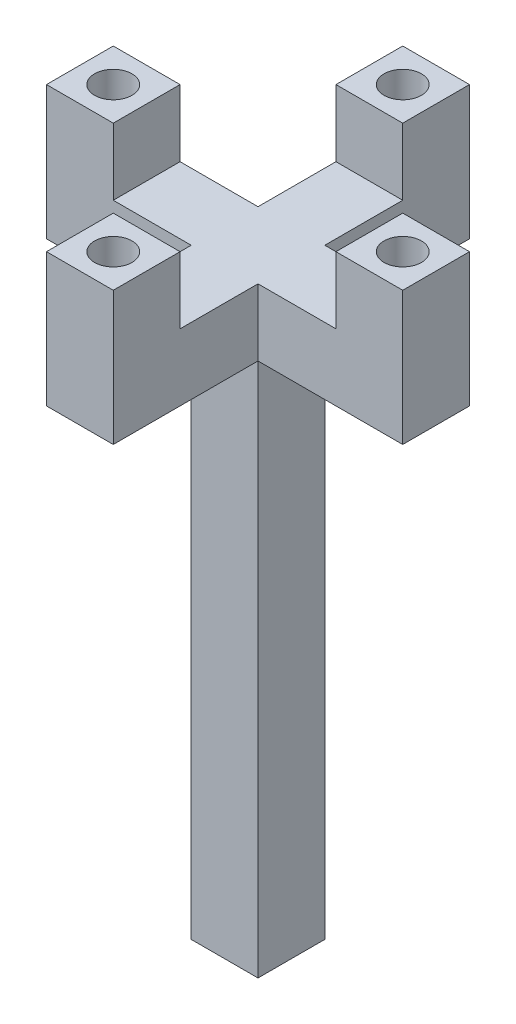
ISO-10303-21;
HEADER;
FILE_DESCRIPTION(('STEP AP214'),'2;1');
FILE_NAME('part.step','',(''),(''),'','','');
FILE_SCHEMA(('AUTOMOTIVE_DESIGN { 1 0 10303 214 1 1 1 1 }'));
ENDSEC;
DATA;
#1=APPLICATION_CONTEXT('core data for automotive mechanical design processes');
#2=APPLICATION_PROTOCOL_DEFINITION('international standard','automotive_design',2000,#1);
#3=PRODUCT_CONTEXT('',#1,'mechanical');
#4=PRODUCT('Part','Part','',(#3));
#5=PRODUCT_RELATED_PRODUCT_CATEGORY('part','',(#4));
#6=PRODUCT_DEFINITION_FORMATION('','',#4);
#7=PRODUCT_DEFINITION_CONTEXT('part definition',#1,'design');
#8=PRODUCT_DEFINITION('design','',#6,#7);
#9=PRODUCT_DEFINITION_SHAPE('','',#8);
#10=(LENGTH_UNIT() NAMED_UNIT(*) SI_UNIT(.MILLI.,.METRE.));
#11=(NAMED_UNIT(*) PLANE_ANGLE_UNIT() SI_UNIT($,.RADIAN.));
#12=(NAMED_UNIT(*) SI_UNIT($,.STERADIAN.) SOLID_ANGLE_UNIT());
#13=UNCERTAINTY_MEASURE_WITH_UNIT(LENGTH_MEASURE(1.E-05),#10,'distance_accuracy_value','');
#14=(GEOMETRIC_REPRESENTATION_CONTEXT(3) GLOBAL_UNCERTAINTY_ASSIGNED_CONTEXT((#13)) GLOBAL_UNIT_ASSIGNED_CONTEXT((#10,
#11,#12)) REPRESENTATION_CONTEXT('',''));
#15=CARTESIAN_POINT('',(0.,0.,0.));
#16=DIRECTION('',(0.,0.,1.));
#17=DIRECTION('',(1.,0.,0.));
#18=AXIS2_PLACEMENT_3D('',#15,#16,#17);
#19=CARTESIAN_POINT('',(0.,0.,7.5));
#20=DIRECTION('',(0.,0.,-1.));
#21=DIRECTION('',(-1.,0.,0.));
#22=AXIS2_PLACEMENT_3D('',#19,#20,#21);
#23=PLANE('',#22);
#24=DIRECTION('',(0.,-1.,0.));
#25=VECTOR('',#24,1.);
#26=CARTESIAN_POINT('',(-3.75000000000001,0.,7.5));
#27=LINE('',#26,#25);
#28=CARTESIAN_POINT('',(-3.75000000000001,67.5,7.5));
#29=VERTEX_POINT('',#28);
#30=CARTESIAN_POINT('',(-3.75000000000001,60.,7.49999999999999));
#31=VERTEX_POINT('',#30);
#32=EDGE_CURVE('E214',#29,#31,#27,.T.);
#33=ORIENTED_EDGE('',*,*,#32,.F.);
#34=DIRECTION('',(-1.,0.,0.));
#35=VECTOR('',#34,1.);
#36=CARTESIAN_POINT('',(12.5,67.5,7.5));
#37=LINE('',#36,#35);
#38=CARTESIAN_POINT('',(-12.5,67.5,7.5));
#39=VERTEX_POINT('',#38);
#40=EDGE_CURVE('E191',#29,#39,#37,.T.);
#41=ORIENTED_EDGE('',*,*,#40,.T.);
#42=DIRECTION('',(0.,1.,0.));
#43=VECTOR('',#42,1.);
#44=CARTESIAN_POINT('',(-12.5,67.5,7.5));
#45=LINE('',#44,#43);
#46=CARTESIAN_POINT('',(-12.5,75.,7.5));
#47=VERTEX_POINT('',#46);
#48=EDGE_CURVE('E242',#39,#47,#45,.T.);
#49=ORIENTED_EDGE('',*,*,#48,.T.);
#50=DIRECTION('',(-1.,0.,0.));
#51=VECTOR('',#50,1.);
#52=CARTESIAN_POINT('',(-12.5,75.,7.5));
#53=LINE('',#52,#51);
#54=CARTESIAN_POINT('',(-20.,75.,7.5));
#55=VERTEX_POINT('',#54);
#56=EDGE_CURVE('E244',#47,#55,#53,.T.);
#57=ORIENTED_EDGE('',*,*,#56,.T.);
#58=DIRECTION('',(0.,-1.,0.));
#59=VECTOR('',#58,1.);
#60=CARTESIAN_POINT('',(-20.,75.,7.5));
#61=LINE('',#60,#59);
#62=CARTESIAN_POINT('',(-20.,60.,7.5));
#63=VERTEX_POINT('',#62);
#64=EDGE_CURVE('E246',#55,#63,#61,.T.);
#65=ORIENTED_EDGE('',*,*,#64,.T.);
#66=DIRECTION('',(1.,0.,0.));
#67=VECTOR('',#66,1.);
#68=CARTESIAN_POINT('',(-20.,60.,7.5));
#69=LINE('',#68,#67);
#70=EDGE_CURVE('E248',#63,#31,#69,.T.);
#71=ORIENTED_EDGE('',*,*,#70,.T.);
#72=EDGE_LOOP('',(#33,#41,#49,#57,#65,#71));
#73=FACE_BOUND('',#72,.T.);
#74=ADVANCED_FACE('F36',(#73),#23,.F.);
#75=DIRECTION('',(1.,0.,0.));
#76=VECTOR('',#75,1.);
#77=CARTESIAN_POINT('',(-3.75000000000001,60.,7.49999999999999));
#78=LINE('',#77,#76);
#79=CARTESIAN_POINT('',(3.75,60.,7.5));
#80=VERTEX_POINT('',#79);
#81=EDGE_CURVE('E361',#31,#80,#78,.T.);
#82=ORIENTED_EDGE('',*,*,#81,.F.);
#83=DIRECTION('',(0.,-1.,0.));
#84=VECTOR('',#83,1.);
#85=CARTESIAN_POINT('',(-3.75,60.,7.5));
#86=LINE('',#85,#84);
#87=CARTESIAN_POINT('',(-3.75,0.,7.5));
#88=VERTEX_POINT('',#87);
#89=EDGE_CURVE('E251',#31,#88,#86,.T.);
#90=ORIENTED_EDGE('',*,*,#89,.T.);
#91=DIRECTION('',(1.,0.,0.));
#92=VECTOR('',#91,1.);
#93=CARTESIAN_POINT('',(3.75,0.,7.5));
#94=LINE('',#93,#92);
#95=CARTESIAN_POINT('',(3.75,0.,7.5));
#96=VERTEX_POINT('',#95);
#97=EDGE_CURVE('E253',#88,#96,#94,.T.);
#98=ORIENTED_EDGE('',*,*,#97,.T.);
#99=DIRECTION('',(0.,1.,0.));
#100=VECTOR('',#99,1.);
#101=CARTESIAN_POINT('',(3.75,60.,7.5));
#102=LINE('',#101,#100);
#103=EDGE_CURVE('E255',#96,#80,#102,.T.);
#104=ORIENTED_EDGE('',*,*,#103,.T.);
#105=EDGE_LOOP('',(#82,#90,#98,#104));
#106=FACE_BOUND('',#105,.T.);
#107=ADVANCED_FACE('F430',(#106),#23,.F.);
#108=CARTESIAN_POINT('',(0.,0.,0.));
#109=DIRECTION('',(0.,0.,-1.));
#110=DIRECTION('',(-1.,0.,0.));
#111=AXIS2_PLACEMENT_3D('',#108,#109,#110);
#112=PLANE('',#111);
#113=DIRECTION('',(-1.,0.,0.));
#114=VECTOR('',#113,1.);
#115=CARTESIAN_POINT('',(0.,67.5,0.));
#116=LINE('',#115,#114);
#117=CARTESIAN_POINT('',(-3.74999999999999,67.5,0.));
#118=VERTEX_POINT('',#117);
#119=CARTESIAN_POINT('',(-12.5,67.5,0.));
#120=VERTEX_POINT('',#119);
#121=EDGE_CURVE('E50',#118,#120,#116,.T.);
#122=ORIENTED_EDGE('',*,*,#121,.F.);
#123=DIRECTION('',(0.,-1.,0.));
#124=VECTOR('',#123,1.);
#125=CARTESIAN_POINT('',(-3.74999999999999,0.,0.));
#126=LINE('',#125,#124);
#127=CARTESIAN_POINT('',(-3.75,60.,0.));
#128=VERTEX_POINT('',#127);
#129=EDGE_CURVE('E11',#118,#128,#126,.T.);
#130=ORIENTED_EDGE('',*,*,#129,.T.);
#131=DIRECTION('',(1.,0.,0.));
#132=VECTOR('',#131,1.);
#133=CARTESIAN_POINT('',(-20.,60.,0.));
#134=LINE('',#133,#132);
#135=CARTESIAN_POINT('',(-20.,60.,0.));
#136=VERTEX_POINT('',#135);
#137=EDGE_CURVE('E275',#136,#128,#134,.T.);
#138=ORIENTED_EDGE('',*,*,#137,.F.);
#139=DIRECTION('',(0.,-1.,0.));
#140=VECTOR('',#139,1.);
#141=CARTESIAN_POINT('',(-20.,75.,0.));
#142=LINE('',#141,#140);
#143=CARTESIAN_POINT('',(-20.,75.,0.));
#144=VERTEX_POINT('',#143);
#145=EDGE_CURVE('E273',#144,#136,#142,.T.);
#146=ORIENTED_EDGE('',*,*,#145,.F.);
#147=DIRECTION('',(-1.,0.,0.));
#148=VECTOR('',#147,1.);
#149=CARTESIAN_POINT('',(-12.5,75.,0.));
#150=LINE('',#149,#148);
#151=CARTESIAN_POINT('',(-12.5,75.,0.));
#152=VERTEX_POINT('',#151);
#153=EDGE_CURVE('E271',#152,#144,#150,.T.);
#154=ORIENTED_EDGE('',*,*,#153,.F.);
#155=DIRECTION('',(0.,1.,0.));
#156=VECTOR('',#155,1.);
#157=CARTESIAN_POINT('',(-12.5,67.5,0.));
#158=LINE('',#157,#156);
#159=EDGE_CURVE('E269',#120,#152,#158,.T.);
#160=ORIENTED_EDGE('',*,*,#159,.F.);
#161=EDGE_LOOP('',(#122,#130,#138,#146,#154,#160));
#162=FACE_BOUND('',#161,.T.);
#163=ADVANCED_FACE('F437',(#162),#112,.T.);
#164=DIRECTION('',(0.,-1.,0.));
#165=VECTOR('',#164,1.);
#166=CARTESIAN_POINT('',(-3.75,60.,0.));
#167=LINE('',#166,#165);
#168=CARTESIAN_POINT('',(-3.75,0.,0.));
#169=VERTEX_POINT('',#168);
#170=EDGE_CURVE('E278',#128,#169,#167,.T.);
#171=ORIENTED_EDGE('',*,*,#170,.F.);
#172=DIRECTION('',(1.,0.,0.));
#173=VECTOR('',#172,1.);
#174=CARTESIAN_POINT('',(-3.74999999999999,60.,0.));
#175=LINE('',#174,#173);
#176=CARTESIAN_POINT('',(3.75000000000001,60.,0.));
#177=VERTEX_POINT('',#176);
#178=EDGE_CURVE('E339',#128,#177,#175,.T.);
#179=ORIENTED_EDGE('',*,*,#178,.T.);
#180=DIRECTION('',(0.,1.,0.));
#181=VECTOR('',#180,1.);
#182=CARTESIAN_POINT('',(3.75,60.,0.));
#183=LINE('',#182,#181);
#184=CARTESIAN_POINT('',(3.75,0.,0.));
#185=VERTEX_POINT('',#184);
#186=EDGE_CURVE('E282',#185,#177,#183,.T.);
#187=ORIENTED_EDGE('',*,*,#186,.F.);
#188=DIRECTION('',(1.,0.,0.));
#189=VECTOR('',#188,1.);
#190=CARTESIAN_POINT('',(3.75,0.,0.));
#191=LINE('',#190,#189);
#192=EDGE_CURVE('E280',#169,#185,#191,.T.);
#193=ORIENTED_EDGE('',*,*,#192,.F.);
#194=EDGE_LOOP('',(#171,#179,#187,#193));
#195=FACE_BOUND('',#194,.T.);
#196=ADVANCED_FACE('F450',(#195),#112,.T.);
#197=CARTESIAN_POINT('',(12.5,75.,7.5));
#198=DIRECTION('',(1.,0.,0.));
#199=DIRECTION('',(0.,0.,-1.));
#200=AXIS2_PLACEMENT_3D('',#197,#198,#199);
#201=PLANE('',#200);
#202=DIRECTION('',(0.,-1.,0.));
#203=VECTOR('',#202,1.);
#204=CARTESIAN_POINT('',(12.5,75.,0.));
#205=LINE('',#204,#203);
#206=CARTESIAN_POINT('',(12.5,75.,0.));
#207=VERTEX_POINT('',#206);
#208=CARTESIAN_POINT('',(12.5,67.5,0.));
#209=VERTEX_POINT('',#208);
#210=EDGE_CURVE('E226',#207,#209,#205,.T.);
#211=ORIENTED_EDGE('',*,*,#210,.T.);
#212=DIRECTION('',(0.,0.,-1.));
#213=VECTOR('',#212,1.);
#214=CARTESIAN_POINT('',(12.5,67.5,7.5));
#215=LINE('',#214,#213);
#216=CARTESIAN_POINT('',(12.5,67.5,7.5));
#217=VERTEX_POINT('',#216);
#218=EDGE_CURVE('E322',#217,#209,#215,.T.);
#219=ORIENTED_EDGE('',*,*,#218,.F.);
#220=DIRECTION('',(0.,-1.,0.));
#221=VECTOR('',#220,1.);
#222=CARTESIAN_POINT('',(12.5,75.,7.5));
#223=LINE('',#222,#221);
#224=CARTESIAN_POINT('',(12.5,75.,7.5));
#225=VERTEX_POINT('',#224);
#226=EDGE_CURVE('E235',#225,#217,#223,.T.);
#227=ORIENTED_EDGE('',*,*,#226,.F.);
#228=DIRECTION('',(0.,0.,-1.));
#229=VECTOR('',#228,1.);
#230=CARTESIAN_POINT('',(12.5,75.,7.5));
#231=LINE('',#230,#229);
#232=EDGE_CURVE('E264',#225,#207,#231,.T.);
#233=ORIENTED_EDGE('',*,*,#232,.T.);
#234=EDGE_LOOP('',(#211,#219,#227,#233));
#235=FACE_BOUND('',#234,.T.);
#236=ADVANCED_FACE('F38',(#235),#201,.F.);
#237=CARTESIAN_POINT('',(0.,67.5,7.5));
#238=DIRECTION('',(0.,-1.,0.));
#239=DIRECTION('',(0.,0.,-1.));
#240=AXIS2_PLACEMENT_3D('',#237,#238,#239);
#241=PLANE('',#240);
#242=ORIENTED_EDGE('',*,*,#40,.F.);
#243=DIRECTION('',(0.,0.,-1.));
#244=VECTOR('',#243,1.);
#245=CARTESIAN_POINT('',(-3.75000000000004,67.5,16.25));
#246=LINE('',#245,#244);
#247=CARTESIAN_POINT('',(-3.75000000000004,67.5,16.25));
#248=VERTEX_POINT('',#247);
#249=EDGE_CURVE('E183',#248,#29,#246,.T.);
#250=ORIENTED_EDGE('',*,*,#249,.F.);
#251=DIRECTION('',(1.,0.,0.));
#252=VECTOR('',#251,1.);
#253=CARTESIAN_POINT('',(-3.75000000000004,67.5,16.25));
#254=LINE('',#253,#252);
#255=CARTESIAN_POINT('',(3.74999999999996,67.5,16.25));
#256=VERTEX_POINT('',#255);
#257=EDGE_CURVE('E188',#248,#256,#254,.T.);
#258=ORIENTED_EDGE('',*,*,#257,.T.);
#259=DIRECTION('',(0.,0.,-1.));
#260=VECTOR('',#259,1.);
#261=CARTESIAN_POINT('',(3.75,67.5,3.75000000000001));
#262=LINE('',#261,#260);
#263=CARTESIAN_POINT('',(3.74999999999999,67.5,7.5));
#264=VERTEX_POINT('',#263);
#265=EDGE_CURVE('E379',#256,#264,#262,.T.);
#266=ORIENTED_EDGE('',*,*,#265,.T.);
#267=EDGE_CURVE('E239',#217,#264,#37,.T.);
#268=ORIENTED_EDGE('',*,*,#267,.F.);
#269=ORIENTED_EDGE('',*,*,#218,.T.);
#270=CARTESIAN_POINT('',(3.75000000000001,67.5,0.));
#271=VERTEX_POINT('',#270);
#272=EDGE_CURVE('E267',#209,#271,#116,.T.);
#273=ORIENTED_EDGE('',*,*,#272,.T.);
#274=CARTESIAN_POINT('',(3.75000000000004,67.5,-8.74999999999999));
#275=VERTEX_POINT('',#274);
#276=EDGE_CURVE('E332',#271,#275,#262,.T.);
#277=ORIENTED_EDGE('',*,*,#276,.T.);
#278=DIRECTION('',(1.,0.,0.));
#279=VECTOR('',#278,1.);
#280=CARTESIAN_POINT('',(-3.74999999999996,67.5,-8.75000000000001));
#281=LINE('',#280,#279);
#282=CARTESIAN_POINT('',(-3.74999999999996,67.5,-8.75000000000001));
#283=VERTEX_POINT('',#282);
#284=EDGE_CURVE('E211',#283,#275,#281,.T.);
#285=ORIENTED_EDGE('',*,*,#284,.F.);
#286=EDGE_CURVE('E195',#118,#283,#246,.T.);
#287=ORIENTED_EDGE('',*,*,#286,.F.);
#288=ORIENTED_EDGE('',*,*,#121,.T.);
#289=DIRECTION('',(0.,0.,-1.));
#290=VECTOR('',#289,1.);
#291=CARTESIAN_POINT('',(-12.5,67.5,7.5));
#292=LINE('',#291,#290);
#293=EDGE_CURVE('E319',#39,#120,#292,.T.);
#294=ORIENTED_EDGE('',*,*,#293,.F.);
#295=EDGE_LOOP('',(#242,#250,#258,#266,#268,#269,#273,#277,#285,#287,#288,#294));
#296=FACE_BOUND('',#295,.T.);
#297=ADVANCED_FACE('F185',(#296),#241,.F.);
#298=CARTESIAN_POINT('',(-12.5,67.5,7.5));
#299=DIRECTION('',(-1.,0.,0.));
#300=DIRECTION('',(0.,0.,1.));
#301=AXIS2_PLACEMENT_3D('',#298,#299,#300);
#302=PLANE('',#301);
#303=ORIENTED_EDGE('',*,*,#159,.T.);
#304=DIRECTION('',(0.,0.,-1.));
#305=VECTOR('',#304,1.);
#306=CARTESIAN_POINT('',(-12.5,75.,7.5));
#307=LINE('',#306,#305);
#308=EDGE_CURVE('E316',#47,#152,#307,.T.);
#309=ORIENTED_EDGE('',*,*,#308,.F.);
#310=ORIENTED_EDGE('',*,*,#48,.F.);
#311=ORIENTED_EDGE('',*,*,#293,.T.);
#312=EDGE_LOOP('',(#303,#309,#310,#311));
#313=FACE_BOUND('',#312,.T.);
#314=ADVANCED_FACE('F506',(#313),#302,.F.);
#315=CARTESIAN_POINT('',(-12.5,75.,7.5));
#316=DIRECTION('',(0.,-1.,0.));
#317=DIRECTION('',(0.,0.,-1.));
#318=AXIS2_PLACEMENT_3D('',#315,#316,#317);
#319=PLANE('',#318);
#320=CARTESIAN_POINT('',(-16.25,75.,3.75));
#321=DIRECTION('',(0.,1.,0.));
#322=DIRECTION('',(0.,0.,1.));
#323=AXIS2_PLACEMENT_3D('',#320,#321,#322);
#324=CIRCLE('',#323,2.1);
#325=CARTESIAN_POINT('',(-16.25,75.,5.85));
#326=VERTEX_POINT('',#325);
#327=EDGE_CURVE('E227',#326,#326,#324,.T.);
#328=ORIENTED_EDGE('',*,*,#327,.F.);
#329=EDGE_LOOP('',(#328));
#330=FACE_BOUND('',#329,.T.);
#331=ORIENTED_EDGE('',*,*,#153,.T.);
#332=DIRECTION('',(0.,0.,-1.));
#333=VECTOR('',#332,1.);
#334=CARTESIAN_POINT('',(-20.,75.,7.5));
#335=LINE('',#334,#333);
#336=EDGE_CURVE('E313',#55,#144,#335,.T.);
#337=ORIENTED_EDGE('',*,*,#336,.F.);
#338=ORIENTED_EDGE('',*,*,#56,.F.);
#339=ORIENTED_EDGE('',*,*,#308,.T.);
#340=EDGE_LOOP('',(#331,#337,#338,#339));
#341=FACE_BOUND('',#340,.T.);
#342=ADVANCED_FACE('F512',(#330,#341),#319,.F.);
#343=CARTESIAN_POINT('',(-20.,75.,7.5));
#344=DIRECTION('',(1.,0.,0.));
#345=DIRECTION('',(0.,0.,-1.));
#346=AXIS2_PLACEMENT_3D('',#343,#344,#345);
#347=PLANE('',#346);
#348=ORIENTED_EDGE('',*,*,#145,.T.);
#349=DIRECTION('',(0.,0.,-1.));
#350=VECTOR('',#349,1.);
#351=CARTESIAN_POINT('',(-20.,60.,7.5));
#352=LINE('',#351,#350);
#353=EDGE_CURVE('E310',#63,#136,#352,.T.);
#354=ORIENTED_EDGE('',*,*,#353,.F.);
#355=ORIENTED_EDGE('',*,*,#64,.F.);
#356=ORIENTED_EDGE('',*,*,#336,.T.);
#357=EDGE_LOOP('',(#348,#354,#355,#356));
#358=FACE_BOUND('',#357,.T.);
#359=ADVANCED_FACE('F515',(#358),#347,.F.);
#360=CARTESIAN_POINT('',(-20.,60.,7.5));
#361=DIRECTION('',(0.,1.,0.));
#362=DIRECTION('',(-1.,0.,0.));
#363=AXIS2_PLACEMENT_3D('',#360,#361,#362);
#364=PLANE('',#363);
#365=ORIENTED_EDGE('',*,*,#137,.T.);
#366=DIRECTION('',(0.,0.,-1.));
#367=VECTOR('',#366,1.);
#368=CARTESIAN_POINT('',(-3.75,60.,7.5));
#369=LINE('',#368,#367);
#370=EDGE_CURVE('E307',#31,#128,#369,.T.);
#371=ORIENTED_EDGE('',*,*,#370,.F.);
#372=ORIENTED_EDGE('',*,*,#70,.F.);
#373=ORIENTED_EDGE('',*,*,#353,.T.);
#374=EDGE_LOOP('',(#365,#371,#372,#373));
#375=FACE_BOUND('',#374,.T.);
#376=ADVANCED_FACE('F474',(#375),#364,.F.);
#377=CARTESIAN_POINT('',(-3.75,60.,7.5));
#378=DIRECTION('',(1.,0.,0.));
#379=DIRECTION('',(0.,0.,-1.));
#380=AXIS2_PLACEMENT_3D('',#377,#378,#379);
#381=PLANE('',#380);
#382=ORIENTED_EDGE('',*,*,#170,.T.);
#383=DIRECTION('',(0.,0.,-1.));
#384=VECTOR('',#383,1.);
#385=CARTESIAN_POINT('',(-3.75,0.,7.5));
#386=LINE('',#385,#384);
#387=EDGE_CURVE('E304',#88,#169,#386,.T.);
#388=ORIENTED_EDGE('',*,*,#387,.F.);
#389=ORIENTED_EDGE('',*,*,#89,.F.);
#390=ORIENTED_EDGE('',*,*,#370,.T.);
#391=EDGE_LOOP('',(#382,#388,#389,#390));
#392=FACE_BOUND('',#391,.T.);
#393=ADVANCED_FACE('F478',(#392),#381,.F.);
#394=CARTESIAN_POINT('',(3.75,0.,7.5));
#395=DIRECTION('',(0.,1.,0.));
#396=DIRECTION('',(0.,0.,1.));
#397=AXIS2_PLACEMENT_3D('',#394,#395,#396);
#398=PLANE('',#397);
#399=ORIENTED_EDGE('',*,*,#192,.T.);
#400=DIRECTION('',(0.,0.,-1.));
#401=VECTOR('',#400,1.);
#402=CARTESIAN_POINT('',(3.75,0.,7.5));
#403=LINE('',#402,#401);
#404=EDGE_CURVE('E301',#96,#185,#403,.T.);
#405=ORIENTED_EDGE('',*,*,#404,.F.);
#406=ORIENTED_EDGE('',*,*,#97,.F.);
#407=ORIENTED_EDGE('',*,*,#387,.T.);
#408=EDGE_LOOP('',(#399,#405,#406,#407));
#409=FACE_BOUND('',#408,.T.);
#410=ADVANCED_FACE('F483',(#409),#398,.F.);
#411=CARTESIAN_POINT('',(3.75,60.,7.5));
#412=DIRECTION('',(-1.,0.,0.));
#413=DIRECTION('',(0.,0.,1.));
#414=AXIS2_PLACEMENT_3D('',#411,#412,#413);
#415=PLANE('',#414);
#416=ORIENTED_EDGE('',*,*,#186,.T.);
#417=DIRECTION('',(0.,0.,-1.));
#418=VECTOR('',#417,1.);
#419=CARTESIAN_POINT('',(3.75,60.,7.5));
#420=LINE('',#419,#418);
#421=EDGE_CURVE('E298',#80,#177,#420,.T.);
#422=ORIENTED_EDGE('',*,*,#421,.F.);
#423=ORIENTED_EDGE('',*,*,#103,.F.);
#424=ORIENTED_EDGE('',*,*,#404,.T.);
#425=EDGE_LOOP('',(#416,#422,#423,#424));
#426=FACE_BOUND('',#425,.T.);
#427=ADVANCED_FACE('F486',(#426),#415,.F.);
#428=CARTESIAN_POINT('',(20.,60.,7.5));
#429=DIRECTION('',(0.,1.,0.));
#430=DIRECTION('',(-1.,0.,0.));
#431=AXIS2_PLACEMENT_3D('',#428,#429,#430);
#432=PLANE('',#431);
#433=DIRECTION('',(1.,0.,0.));
#434=VECTOR('',#433,1.);
#435=CARTESIAN_POINT('',(20.,60.,0.));
#436=LINE('',#435,#434);
#437=CARTESIAN_POINT('',(20.,60.,0.));
#438=VERTEX_POINT('',#437);
#439=EDGE_CURVE('E285',#177,#438,#436,.T.);
#440=ORIENTED_EDGE('',*,*,#439,.T.);
#441=DIRECTION('',(0.,0.,-1.));
#442=VECTOR('',#441,1.);
#443=CARTESIAN_POINT('',(20.,60.,7.5));
#444=LINE('',#443,#442);
#445=CARTESIAN_POINT('',(20.,60.,7.5));
#446=VERTEX_POINT('',#445);
#447=EDGE_CURVE('E295',#446,#438,#444,.T.);
#448=ORIENTED_EDGE('',*,*,#447,.F.);
#449=DIRECTION('',(1.,0.,0.));
#450=VECTOR('',#449,1.);
#451=CARTESIAN_POINT('',(20.,60.,7.5));
#452=LINE('',#451,#450);
#453=EDGE_CURVE('E258',#80,#446,#452,.T.);
#454=ORIENTED_EDGE('',*,*,#453,.F.);
#455=ORIENTED_EDGE('',*,*,#421,.T.);
#456=EDGE_LOOP('',(#440,#448,#454,#455));
#457=FACE_BOUND('',#456,.T.);
#458=ADVANCED_FACE('F490',(#457),#432,.F.);
#459=CARTESIAN_POINT('',(20.,75.,7.5));
#460=DIRECTION('',(-1.,0.,0.));
#461=DIRECTION('',(0.,-1.,0.));
#462=AXIS2_PLACEMENT_3D('',#459,#460,#461);
#463=PLANE('',#462);
#464=DIRECTION('',(0.,1.,0.));
#465=VECTOR('',#464,1.);
#466=CARTESIAN_POINT('',(20.,75.,0.));
#467=LINE('',#466,#465);
#468=CARTESIAN_POINT('',(20.,75.,0.));
#469=VERTEX_POINT('',#468);
#470=EDGE_CURVE('E287',#438,#469,#467,.T.);
#471=ORIENTED_EDGE('',*,*,#470,.T.);
#472=DIRECTION('',(0.,0.,-1.));
#473=VECTOR('',#472,1.);
#474=CARTESIAN_POINT('',(20.,75.,7.5));
#475=LINE('',#474,#473);
#476=CARTESIAN_POINT('',(20.,75.,7.5));
#477=VERTEX_POINT('',#476);
#478=EDGE_CURVE('E292',#477,#469,#475,.T.);
#479=ORIENTED_EDGE('',*,*,#478,.F.);
#480=DIRECTION('',(0.,1.,0.));
#481=VECTOR('',#480,1.);
#482=CARTESIAN_POINT('',(20.,75.,7.5));
#483=LINE('',#482,#481);
#484=EDGE_CURVE('E260',#446,#477,#483,.T.);
#485=ORIENTED_EDGE('',*,*,#484,.F.);
#486=ORIENTED_EDGE('',*,*,#447,.T.);
#487=EDGE_LOOP('',(#471,#479,#485,#486));
#488=FACE_BOUND('',#487,.T.);
#489=ADVANCED_FACE('F451',(#488),#463,.F.);
#490=CARTESIAN_POINT('',(12.5,75.,7.5));
#491=DIRECTION('',(0.,-1.,0.));
#492=DIRECTION('',(0.,0.,-1.));
#493=AXIS2_PLACEMENT_3D('',#490,#491,#492);
#494=PLANE('',#493);
#495=CARTESIAN_POINT('',(16.25,75.,3.75));
#496=DIRECTION('',(0.,1.,0.));
#497=DIRECTION('',(0.,0.,1.));
#498=AXIS2_PLACEMENT_3D('',#495,#496,#497);
#499=CIRCLE('',#498,2.1);
#500=CARTESIAN_POINT('',(16.25,75.,5.85));
#501=VERTEX_POINT('',#500);
#502=EDGE_CURVE('E222',#501,#501,#499,.T.);
#503=ORIENTED_EDGE('',*,*,#502,.F.);
#504=EDGE_LOOP('',(#503));
#505=FACE_BOUND('',#504,.T.);
#506=DIRECTION('',(-1.,0.,0.));
#507=VECTOR('',#506,1.);
#508=CARTESIAN_POINT('',(12.5,75.,0.));
#509=LINE('',#508,#507);
#510=EDGE_CURVE('E238',#469,#207,#509,.T.);
#511=ORIENTED_EDGE('',*,*,#510,.T.);
#512=ORIENTED_EDGE('',*,*,#232,.F.);
#513=DIRECTION('',(-1.,0.,0.));
#514=VECTOR('',#513,1.);
#515=CARTESIAN_POINT('',(12.5,75.,7.5));
#516=LINE('',#515,#514);
#517=EDGE_CURVE('E262',#477,#225,#516,.T.);
#518=ORIENTED_EDGE('',*,*,#517,.F.);
#519=ORIENTED_EDGE('',*,*,#478,.T.);
#520=EDGE_LOOP('',(#511,#512,#518,#519));
#521=FACE_BOUND('',#520,.T.);
#522=ADVANCED_FACE('F443',(#505,#521),#494,.F.);
#523=ORIENTED_EDGE('',*,*,#267,.T.);
#524=DIRECTION('',(0.,-1.,0.));
#525=VECTOR('',#524,1.);
#526=CARTESIAN_POINT('',(3.74999999999999,0.,7.5));
#527=LINE('',#526,#525);
#528=EDGE_CURVE('E210',#264,#80,#527,.T.);
#529=ORIENTED_EDGE('',*,*,#528,.T.);
#530=ORIENTED_EDGE('',*,*,#453,.T.);
#531=ORIENTED_EDGE('',*,*,#484,.T.);
#532=ORIENTED_EDGE('',*,*,#517,.T.);
#533=ORIENTED_EDGE('',*,*,#226,.T.);
#534=EDGE_LOOP('',(#523,#529,#530,#531,#532,#533));
#535=FACE_BOUND('',#534,.T.);
#536=ADVANCED_FACE('F433',(#535),#23,.F.);
#537=DIRECTION('',(0.,-1.,0.));
#538=VECTOR('',#537,1.);
#539=CARTESIAN_POINT('',(3.75000000000001,0.,0.));
#540=LINE('',#539,#538);
#541=EDGE_CURVE('E44',#271,#177,#540,.T.);
#542=ORIENTED_EDGE('',*,*,#541,.F.);
#543=ORIENTED_EDGE('',*,*,#272,.F.);
#544=ORIENTED_EDGE('',*,*,#210,.F.);
#545=ORIENTED_EDGE('',*,*,#510,.F.);
#546=ORIENTED_EDGE('',*,*,#470,.F.);
#547=ORIENTED_EDGE('',*,*,#439,.F.);
#548=EDGE_LOOP('',(#542,#543,#544,#545,#546,#547));
#549=FACE_BOUND('',#548,.T.);
#550=ADVANCED_FACE('F442',(#549),#112,.T.);
#551=CARTESIAN_POINT('',(16.25,70.,3.75));
#552=DIRECTION('',(0.,1.,0.));
#553=DIRECTION('',(0.,0.,1.));
#554=AXIS2_PLACEMENT_3D('',#551,#552,#553);
#555=CYLINDRICAL_SURFACE('',#554,2.1);
#556=CARTESIAN_POINT('',(16.25,70.,3.75));
#557=DIRECTION('',(0.,1.,0.));
#558=DIRECTION('',(0.,0.,1.));
#559=AXIS2_PLACEMENT_3D('',#556,#557,#558);
#560=CIRCLE('',#559,2.1);
#561=CARTESIAN_POINT('',(16.25,70.,5.85));
#562=VERTEX_POINT('',#561);
#563=EDGE_CURVE('E230',#562,#562,#560,.T.);
#564=ORIENTED_EDGE('',*,*,#563,.F.);
#565=EDGE_LOOP('',(#564));
#566=FACE_BOUND('',#565,.T.);
#567=ORIENTED_EDGE('',*,*,#502,.T.);
#568=EDGE_LOOP('',(#567));
#569=FACE_BOUND('',#568,.T.);
#570=ADVANCED_FACE('F449',(#566,#569),#555,.F.);
#571=CARTESIAN_POINT('',(16.25,70.,3.75));
#572=DIRECTION('',(0.,1.,0.));
#573=DIRECTION('',(0.,0.,1.));
#574=AXIS2_PLACEMENT_3D('',#571,#572,#573);
#575=PLANE('',#574);
#576=ORIENTED_EDGE('',*,*,#563,.T.);
#577=EDGE_LOOP('',(#576));
#578=FACE_BOUND('',#577,.T.);
#579=ADVANCED_FACE('F744',(#578),#575,.T.);
#580=CARTESIAN_POINT('',(-16.25,70.,3.75));
#581=DIRECTION('',(0.,1.,0.));
#582=DIRECTION('',(0.,0.,1.));
#583=AXIS2_PLACEMENT_3D('',#580,#581,#582);
#584=CYLINDRICAL_SURFACE('',#583,2.1);
#585=CARTESIAN_POINT('',(-16.25,70.,3.75));
#586=DIRECTION('',(0.,1.,0.));
#587=DIRECTION('',(0.,0.,1.));
#588=AXIS2_PLACEMENT_3D('',#585,#586,#587);
#589=CIRCLE('',#588,2.1);
#590=CARTESIAN_POINT('',(-16.25,70.,5.85));
#591=VERTEX_POINT('',#590);
#592=EDGE_CURVE('E223',#591,#591,#589,.T.);
#593=ORIENTED_EDGE('',*,*,#592,.F.);
#594=EDGE_LOOP('',(#593));
#595=FACE_BOUND('',#594,.T.);
#596=ORIENTED_EDGE('',*,*,#327,.T.);
#597=EDGE_LOOP('',(#596));
#598=FACE_BOUND('',#597,.T.);
#599=ADVANCED_FACE('F740',(#595,#598),#584,.F.);
#600=CARTESIAN_POINT('',(-16.25,70.,3.75));
#601=DIRECTION('',(0.,1.,0.));
#602=DIRECTION('',(0.,0.,1.));
#603=AXIS2_PLACEMENT_3D('',#600,#601,#602);
#604=PLANE('',#603);
#605=ORIENTED_EDGE('',*,*,#592,.T.);
#606=EDGE_LOOP('',(#605));
#607=FACE_BOUND('',#606,.T.);
#608=ADVANCED_FACE('F597',(#607),#604,.T.);
#609=CARTESIAN_POINT('',(0.,70.,-12.5));
#610=DIRECTION('',(0.,1.,0.));
#611=DIRECTION('',(-1.,0.,0.));
#612=AXIS2_PLACEMENT_3D('',#609,#610,#611);
#613=PLANE('',#612);
#614=CARTESIAN_POINT('',(0.,70.,-12.5));
#615=DIRECTION('',(0.,1.,0.));
#616=DIRECTION('',(-1.,0.,0.));
#617=AXIS2_PLACEMENT_3D('',#614,#615,#616);
#618=CIRCLE('',#617,2.1);
#619=CARTESIAN_POINT('',(-2.09999999999994,70.,-12.5));
#620=VERTEX_POINT('',#619);
#621=EDGE_CURVE('E384',#620,#620,#618,.T.);
#622=ORIENTED_EDGE('',*,*,#621,.T.);
#623=EDGE_LOOP('',(#622));
#624=FACE_BOUND('',#623,.T.);
#625=ADVANCED_FACE('F409',(#624),#613,.T.);
#626=CARTESIAN_POINT('',(0.,70.,-12.5));
#627=DIRECTION('',(0.,1.,0.));
#628=DIRECTION('',(-1.,0.,0.));
#629=AXIS2_PLACEMENT_3D('',#626,#627,#628);
#630=CYLINDRICAL_SURFACE('',#629,2.1);
#631=ORIENTED_EDGE('',*,*,#621,.F.);
#632=EDGE_LOOP('',(#631));
#633=FACE_BOUND('',#632,.T.);
#634=CARTESIAN_POINT('',(0.,75.,-12.5));
#635=DIRECTION('',(0.,1.,0.));
#636=DIRECTION('',(-1.,0.,0.));
#637=AXIS2_PLACEMENT_3D('',#634,#635,#636);
#638=CIRCLE('',#637,2.1);
#639=CARTESIAN_POINT('',(-2.09999999999994,75.,-12.5));
#640=VERTEX_POINT('',#639);
#641=EDGE_CURVE('E403',#640,#640,#638,.T.);
#642=ORIENTED_EDGE('',*,*,#641,.T.);
#643=EDGE_LOOP('',(#642));
#644=FACE_BOUND('',#643,.T.);
#645=ADVANCED_FACE('F411',(#633,#644),#630,.F.);
#646=CARTESIAN_POINT('',(-3.74999999999996,67.5,-8.75000000000001));
#647=DIRECTION('',(0.,0.,-1.));
#648=DIRECTION('',(-1.,0.,0.));
#649=AXIS2_PLACEMENT_3D('',#646,#647,#648);
#650=PLANE('',#649);
#651=DIRECTION('',(0.,1.,0.));
#652=VECTOR('',#651,1.);
#653=CARTESIAN_POINT('',(3.75000000000004,67.5,-8.74999999999999));
#654=LINE('',#653,#652);
#655=CARTESIAN_POINT('',(3.75000000000004,75.,-8.74999999999999));
#656=VERTEX_POINT('',#655);
#657=EDGE_CURVE('E378',#275,#656,#654,.T.);
#658=ORIENTED_EDGE('',*,*,#657,.T.);
#659=DIRECTION('',(1.,0.,0.));
#660=VECTOR('',#659,1.);
#661=CARTESIAN_POINT('',(-3.74999999999996,75.,-8.75000000000001));
#662=LINE('',#661,#660);
#663=CARTESIAN_POINT('',(-3.74999999999996,75.,-8.75000000000001));
#664=VERTEX_POINT('',#663);
#665=EDGE_CURVE('E217',#664,#656,#662,.T.);
#666=ORIENTED_EDGE('',*,*,#665,.F.);
#667=DIRECTION('',(0.,1.,0.));
#668=VECTOR('',#667,1.);
#669=CARTESIAN_POINT('',(-3.74999999999996,67.5,-8.75000000000001));
#670=LINE('',#669,#668);
#671=EDGE_CURVE('E194',#283,#664,#670,.T.);
#672=ORIENTED_EDGE('',*,*,#671,.F.);
#673=ORIENTED_EDGE('',*,*,#284,.T.);
#674=EDGE_LOOP('',(#658,#666,#672,#673));
#675=FACE_BOUND('',#674,.T.);
#676=ADVANCED_FACE('F414',(#675),#650,.F.);
#677=CARTESIAN_POINT('',(-3.74999999999996,75.,-8.75000000000001));
#678=DIRECTION('',(0.,-1.,0.));
#679=DIRECTION('',(1.,0.,0.));
#680=AXIS2_PLACEMENT_3D('',#677,#678,#679);
#681=PLANE('',#680);
#682=ORIENTED_EDGE('',*,*,#641,.F.);
#683=EDGE_LOOP('',(#682));
#684=FACE_BOUND('',#683,.T.);
#685=DIRECTION('',(0.,0.,-1.));
#686=VECTOR('',#685,1.);
#687=CARTESIAN_POINT('',(3.75000000000004,75.,-8.74999999999999));
#688=LINE('',#687,#686);
#689=CARTESIAN_POINT('',(3.75000000000007,75.,-16.25));
#690=VERTEX_POINT('',#689);
#691=EDGE_CURVE('E347',#656,#690,#688,.T.);
#692=ORIENTED_EDGE('',*,*,#691,.T.);
#693=DIRECTION('',(1.,0.,0.));
#694=VECTOR('',#693,1.);
#695=CARTESIAN_POINT('',(-3.74999999999993,75.,-16.25));
#696=LINE('',#695,#694);
#697=CARTESIAN_POINT('',(-3.74999999999993,75.,-16.25));
#698=VERTEX_POINT('',#697);
#699=EDGE_CURVE('E366',#698,#690,#696,.T.);
#700=ORIENTED_EDGE('',*,*,#699,.F.);
#701=DIRECTION('',(0.,0.,-1.));
#702=VECTOR('',#701,1.);
#703=CARTESIAN_POINT('',(-3.74999999999996,75.,-8.75000000000001));
#704=LINE('',#703,#702);
#705=EDGE_CURVE('E375',#664,#698,#704,.T.);
#706=ORIENTED_EDGE('',*,*,#705,.F.);
#707=ORIENTED_EDGE('',*,*,#665,.T.);
#708=EDGE_LOOP('',(#692,#700,#706,#707));
#709=FACE_BOUND('',#708,.T.);
#710=ADVANCED_FACE('F373',(#684,#709),#681,.F.);
#711=CARTESIAN_POINT('',(-3.74999999999993,75.,-16.25));
#712=DIRECTION('',(0.,0.,1.));
#713=DIRECTION('',(1.,0.,0.));
#714=AXIS2_PLACEMENT_3D('',#711,#712,#713);
#715=PLANE('',#714);
#716=DIRECTION('',(0.,-1.,0.));
#717=VECTOR('',#716,1.);
#718=CARTESIAN_POINT('',(3.75000000000007,75.,-16.25));
#719=LINE('',#718,#717);
#720=CARTESIAN_POINT('',(3.75000000000007,60.,-16.25));
#721=VERTEX_POINT('',#720);
#722=EDGE_CURVE('E343',#690,#721,#719,.T.);
#723=ORIENTED_EDGE('',*,*,#722,.T.);
#724=DIRECTION('',(1.,0.,0.));
#725=VECTOR('',#724,1.);
#726=CARTESIAN_POINT('',(-3.74999999999993,60.,-16.25));
#727=LINE('',#726,#725);
#728=CARTESIAN_POINT('',(-3.74999999999993,60.,-16.25));
#729=VERTEX_POINT('',#728);
#730=EDGE_CURVE('E341',#729,#721,#727,.T.);
#731=ORIENTED_EDGE('',*,*,#730,.F.);
#732=DIRECTION('',(0.,-1.,0.));
#733=VECTOR('',#732,1.);
#734=CARTESIAN_POINT('',(-3.74999999999993,75.,-16.25));
#735=LINE('',#734,#733);
#736=EDGE_CURVE('E393',#698,#729,#735,.T.);
#737=ORIENTED_EDGE('',*,*,#736,.F.);
#738=ORIENTED_EDGE('',*,*,#699,.T.);
#739=EDGE_LOOP('',(#723,#731,#737,#738));
#740=FACE_BOUND('',#739,.T.);
#741=ADVANCED_FACE('F419',(#740),#715,.F.);
#742=CARTESIAN_POINT('',(-3.75,0.,3.74999999999999));
#743=DIRECTION('',(1.,0.,0.));
#744=DIRECTION('',(0.,0.,-1.));
#745=AXIS2_PLACEMENT_3D('',#742,#743,#744);
#746=PLANE('',#745);
#747=ORIENTED_EDGE('',*,*,#129,.F.);
#748=ORIENTED_EDGE('',*,*,#286,.T.);
#749=ORIENTED_EDGE('',*,*,#671,.T.);
#750=ORIENTED_EDGE('',*,*,#705,.T.);
#751=ORIENTED_EDGE('',*,*,#736,.T.);
#752=DIRECTION('',(0.,0.,1.));
#753=VECTOR('',#752,1.);
#754=CARTESIAN_POINT('',(-3.74999999999993,60.,-16.25));
#755=LINE('',#754,#753);
#756=EDGE_CURVE('E390',#729,#128,#755,.T.);
#757=ORIENTED_EDGE('',*,*,#756,.T.);
#758=EDGE_LOOP('',(#747,#748,#749,#750,#751,#757));
#759=FACE_BOUND('',#758,.T.);
#760=ADVANCED_FACE('F425',(#759),#746,.F.);
#761=CARTESIAN_POINT('',(3.75,0.,3.75000000000001));
#762=DIRECTION('',(1.,0.,0.));
#763=DIRECTION('',(0.,0.,-1.));
#764=AXIS2_PLACEMENT_3D('',#761,#762,#763);
#765=PLANE('',#764);
#766=ORIENTED_EDGE('',*,*,#276,.F.);
#767=ORIENTED_EDGE('',*,*,#541,.T.);
#768=DIRECTION('',(0.,0.,1.));
#769=VECTOR('',#768,1.);
#770=CARTESIAN_POINT('',(3.75000000000007,60.,-16.25));
#771=LINE('',#770,#769);
#772=EDGE_CURVE('E330',#721,#177,#771,.T.);
#773=ORIENTED_EDGE('',*,*,#772,.F.);
#774=ORIENTED_EDGE('',*,*,#722,.F.);
#775=ORIENTED_EDGE('',*,*,#691,.F.);
#776=ORIENTED_EDGE('',*,*,#657,.F.);
#777=EDGE_LOOP('',(#766,#767,#773,#774,#775,#776));
#778=FACE_BOUND('',#777,.T.);
#779=ADVANCED_FACE('F328',(#778),#765,.T.);
#780=CARTESIAN_POINT('',(-3.74999999999993,60.,-16.25));
#781=DIRECTION('',(0.,1.,0.));
#782=DIRECTION('',(0.,0.,-1.));
#783=AXIS2_PLACEMENT_3D('',#780,#781,#782);
#784=PLANE('',#783);
#785=ORIENTED_EDGE('',*,*,#772,.T.);
#786=ORIENTED_EDGE('',*,*,#178,.F.);
#787=ORIENTED_EDGE('',*,*,#756,.F.);
#788=ORIENTED_EDGE('',*,*,#730,.T.);
#789=EDGE_LOOP('',(#785,#786,#787,#788));
#790=FACE_BOUND('',#789,.T.);
#791=ADVANCED_FACE('F336',(#790),#784,.F.);
#792=ORIENTED_EDGE('',*,*,#249,.T.);
#793=ORIENTED_EDGE('',*,*,#32,.T.);
#794=DIRECTION('',(0.,0.,1.));
#795=VECTOR('',#794,1.);
#796=CARTESIAN_POINT('',(-3.75000000000007,60.,23.75));
#797=LINE('',#796,#795);
#798=CARTESIAN_POINT('',(-3.75000000000007,60.,23.75));
#799=VERTEX_POINT('',#798);
#800=EDGE_CURVE('E388',#31,#799,#797,.T.);
#801=ORIENTED_EDGE('',*,*,#800,.T.);
#802=DIRECTION('',(0.,1.,0.));
#803=VECTOR('',#802,1.);
#804=CARTESIAN_POINT('',(-3.75000000000007,75.,23.75));
#805=LINE('',#804,#803);
#806=CARTESIAN_POINT('',(-3.75000000000007,75.,23.75));
#807=VERTEX_POINT('',#806);
#808=EDGE_CURVE('E386',#799,#807,#805,.T.);
#809=ORIENTED_EDGE('',*,*,#808,.T.);
#810=DIRECTION('',(0.,0.,-1.));
#811=VECTOR('',#810,1.);
#812=CARTESIAN_POINT('',(-3.75000000000004,75.,16.25));
#813=LINE('',#812,#811);
#814=CARTESIAN_POINT('',(-3.75000000000004,75.,16.25));
#815=VERTEX_POINT('',#814);
#816=EDGE_CURVE('E201',#807,#815,#813,.T.);
#817=ORIENTED_EDGE('',*,*,#816,.T.);
#818=DIRECTION('',(0.,-1.,0.));
#819=VECTOR('',#818,1.);
#820=CARTESIAN_POINT('',(-3.75000000000004,75.,16.25));
#821=LINE('',#820,#819);
#822=EDGE_CURVE('E198',#815,#248,#821,.T.);
#823=ORIENTED_EDGE('',*,*,#822,.T.);
#824=EDGE_LOOP('',(#792,#793,#801,#809,#817,#823));
#825=FACE_BOUND('',#824,.T.);
#826=ADVANCED_FACE('F199',(#825),#746,.F.);
#827=ORIENTED_EDGE('',*,*,#528,.F.);
#828=ORIENTED_EDGE('',*,*,#265,.F.);
#829=DIRECTION('',(0.,-1.,0.));
#830=VECTOR('',#829,1.);
#831=CARTESIAN_POINT('',(3.74999999999996,75.,16.25));
#832=LINE('',#831,#830);
#833=CARTESIAN_POINT('',(3.74999999999996,75.,16.25));
#834=VERTEX_POINT('',#833);
#835=EDGE_CURVE('E209',#834,#256,#832,.T.);
#836=ORIENTED_EDGE('',*,*,#835,.F.);
#837=DIRECTION('',(0.,0.,-1.));
#838=VECTOR('',#837,1.);
#839=CARTESIAN_POINT('',(3.74999999999996,75.,16.25));
#840=LINE('',#839,#838);
#841=CARTESIAN_POINT('',(3.74999999999993,75.,23.75));
#842=VERTEX_POINT('',#841);
#843=EDGE_CURVE('E205',#842,#834,#840,.T.);
#844=ORIENTED_EDGE('',*,*,#843,.F.);
#845=DIRECTION('',(0.,1.,0.));
#846=VECTOR('',#845,1.);
#847=CARTESIAN_POINT('',(3.74999999999993,75.,23.75));
#848=LINE('',#847,#846);
#849=CARTESIAN_POINT('',(3.74999999999993,60.,23.75));
#850=VERTEX_POINT('',#849);
#851=EDGE_CURVE('E345',#850,#842,#848,.T.);
#852=ORIENTED_EDGE('',*,*,#851,.F.);
#853=DIRECTION('',(0.,0.,1.));
#854=VECTOR('',#853,1.);
#855=CARTESIAN_POINT('',(3.74999999999993,60.,23.75));
#856=LINE('',#855,#854);
#857=EDGE_CURVE('E342',#80,#850,#856,.T.);
#858=ORIENTED_EDGE('',*,*,#857,.F.);
#859=EDGE_LOOP('',(#827,#828,#836,#844,#852,#858));
#860=FACE_BOUND('',#859,.T.);
#861=ADVANCED_FACE('F457',(#860),#765,.T.);
#862=CARTESIAN_POINT('',(-3.75000000000004,75.,16.25));
#863=DIRECTION('',(0.,0.,1.));
#864=DIRECTION('',(1.,0.,0.));
#865=AXIS2_PLACEMENT_3D('',#862,#863,#864);
#866=PLANE('',#865);
#867=ORIENTED_EDGE('',*,*,#835,.T.);
#868=ORIENTED_EDGE('',*,*,#257,.F.);
#869=ORIENTED_EDGE('',*,*,#822,.F.);
#870=DIRECTION('',(1.,0.,0.));
#871=VECTOR('',#870,1.);
#872=CARTESIAN_POINT('',(-3.75000000000004,75.,16.25));
#873=LINE('',#872,#871);
#874=EDGE_CURVE('E353',#815,#834,#873,.T.);
#875=ORIENTED_EDGE('',*,*,#874,.T.);
#876=EDGE_LOOP('',(#867,#868,#869,#875));
#877=FACE_BOUND('',#876,.T.);
#878=ADVANCED_FACE('F207',(#877),#866,.F.);
#879=CARTESIAN_POINT('',(-3.75000000000007,60.,23.75));
#880=DIRECTION('',(0.,1.,0.));
#881=DIRECTION('',(0.,0.,-1.));
#882=AXIS2_PLACEMENT_3D('',#879,#880,#881);
#883=PLANE('',#882);
#884=ORIENTED_EDGE('',*,*,#857,.T.);
#885=DIRECTION('',(1.,0.,0.));
#886=VECTOR('',#885,1.);
#887=CARTESIAN_POINT('',(-3.75000000000007,60.,23.75));
#888=LINE('',#887,#886);
#889=EDGE_CURVE('E358',#799,#850,#888,.T.);
#890=ORIENTED_EDGE('',*,*,#889,.F.);
#891=ORIENTED_EDGE('',*,*,#800,.F.);
#892=ORIENTED_EDGE('',*,*,#81,.T.);
#893=EDGE_LOOP('',(#884,#890,#891,#892));
#894=FACE_BOUND('',#893,.T.);
#895=ADVANCED_FACE('F464',(#894),#883,.F.);
#896=CARTESIAN_POINT('',(-3.75000000000007,75.,23.75));
#897=DIRECTION('',(0.,0.,-1.));
#898=DIRECTION('',(0.,-1.,0.));
#899=AXIS2_PLACEMENT_3D('',#896,#897,#898);
#900=PLANE('',#899);
#901=ORIENTED_EDGE('',*,*,#851,.T.);
#902=DIRECTION('',(1.,0.,0.));
#903=VECTOR('',#902,1.);
#904=CARTESIAN_POINT('',(-3.75000000000007,75.,23.75));
#905=LINE('',#904,#903);
#906=EDGE_CURVE('E355',#807,#842,#905,.T.);
#907=ORIENTED_EDGE('',*,*,#906,.F.);
#908=ORIENTED_EDGE('',*,*,#808,.F.);
#909=ORIENTED_EDGE('',*,*,#889,.T.);
#910=EDGE_LOOP('',(#901,#907,#908,#909));
#911=FACE_BOUND('',#910,.T.);
#912=ADVANCED_FACE('F680',(#911),#900,.F.);
#913=CARTESIAN_POINT('',(-3.75000000000004,75.,16.25));
#914=DIRECTION('',(0.,-1.,0.));
#915=DIRECTION('',(1.,0.,0.));
#916=AXIS2_PLACEMENT_3D('',#913,#914,#915);
#917=PLANE('',#916);
#918=CARTESIAN_POINT('',(0.,75.,20.));
#919=DIRECTION('',(0.,1.,0.));
#920=DIRECTION('',(-1.,0.,0.));
#921=AXIS2_PLACEMENT_3D('',#918,#919,#920);
#922=CIRCLE('',#921,2.1);
#923=CARTESIAN_POINT('',(-2.10000000000006,75.,20.));
#924=VERTEX_POINT('',#923);
#925=EDGE_CURVE('E397',#924,#924,#922,.T.);
#926=ORIENTED_EDGE('',*,*,#925,.F.);
#927=EDGE_LOOP('',(#926));
#928=FACE_BOUND('',#927,.T.);
#929=ORIENTED_EDGE('',*,*,#843,.T.);
#930=ORIENTED_EDGE('',*,*,#874,.F.);
#931=ORIENTED_EDGE('',*,*,#816,.F.);
#932=ORIENTED_EDGE('',*,*,#906,.T.);
#933=EDGE_LOOP('',(#929,#930,#931,#932));
#934=FACE_BOUND('',#933,.T.);
#935=ADVANCED_FACE('F689',(#928,#934),#917,.F.);
#936=CARTESIAN_POINT('',(0.,70.,20.));
#937=DIRECTION('',(0.,1.,0.));
#938=DIRECTION('',(-1.,0.,0.));
#939=AXIS2_PLACEMENT_3D('',#936,#937,#938);
#940=CYLINDRICAL_SURFACE('',#939,2.1);
#941=CARTESIAN_POINT('',(0.,70.,20.));
#942=DIRECTION('',(0.,1.,0.));
#943=DIRECTION('',(-1.,0.,0.));
#944=AXIS2_PLACEMENT_3D('',#941,#942,#943);
#945=CIRCLE('',#944,2.1);
#946=CARTESIAN_POINT('',(-2.10000000000006,70.,20.));
#947=VERTEX_POINT('',#946);
#948=EDGE_CURVE('E400',#947,#947,#945,.T.);
#949=ORIENTED_EDGE('',*,*,#948,.F.);
#950=EDGE_LOOP('',(#949));
#951=FACE_BOUND('',#950,.T.);
#952=ORIENTED_EDGE('',*,*,#925,.T.);
#953=EDGE_LOOP('',(#952));
#954=FACE_BOUND('',#953,.T.);
#955=ADVANCED_FACE('F698',(#951,#954),#940,.F.);
#956=CARTESIAN_POINT('',(0.,70.,20.));
#957=DIRECTION('',(0.,1.,0.));
#958=DIRECTION('',(-1.,0.,0.));
#959=AXIS2_PLACEMENT_3D('',#956,#957,#958);
#960=PLANE('',#959);
#961=ORIENTED_EDGE('',*,*,#948,.T.);
#962=EDGE_LOOP('',(#961));
#963=FACE_BOUND('',#962,.T.);
#964=ADVANCED_FACE('F707',(#963),#960,.T.);
#965=CLOSED_SHELL('',(#74,#107,#163,#196,#236,#297,#314,#342,#359,#376,#393,#410,#427,#458,#489,
#522,#536,#550,#570,#579,#599,#608,#625,#645,#676,#710,#741,#760,#779,#791,#826,#861,#878,#895,
#912,#935,#955,#964));
#966=MANIFOLD_SOLID_BREP('B2',#965);
#967=ADVANCED_BREP_SHAPE_REPRESENTATION('',(#18,#966),#14);
#968=SHAPE_DEFINITION_REPRESENTATION(#9,#967);
ENDSEC;
END-ISO-10303-21;
